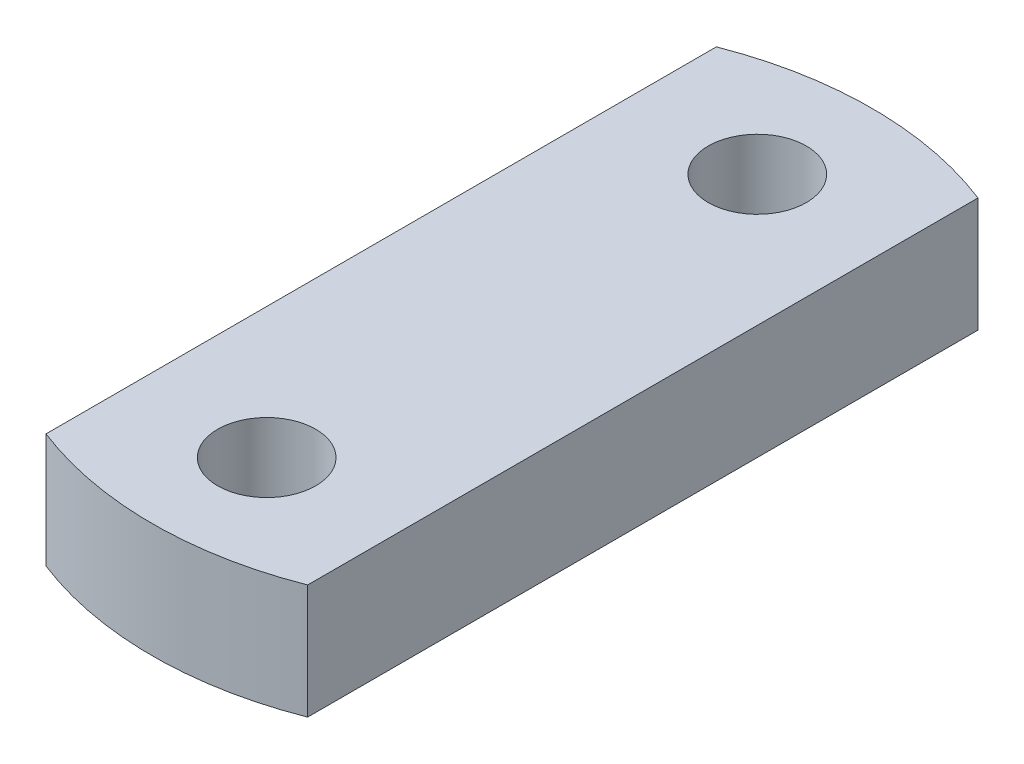
ISO-10303-21;
HEADER;
FILE_DESCRIPTION(('STEP AP214'),'2;1');
FILE_NAME('part.step','',(''),(''),'','','');
FILE_SCHEMA(('AUTOMOTIVE_DESIGN { 1 0 10303 214 1 1 1 1 }'));
ENDSEC;
DATA;
#1=APPLICATION_CONTEXT('core data for automotive mechanical design processes');
#2=APPLICATION_PROTOCOL_DEFINITION('international standard','automotive_design',2000,#1);
#3=PRODUCT_CONTEXT('',#1,'mechanical');
#4=PRODUCT('Part','Part','',(#3));
#5=PRODUCT_RELATED_PRODUCT_CATEGORY('part','',(#4));
#6=PRODUCT_DEFINITION_FORMATION('','',#4);
#7=PRODUCT_DEFINITION_CONTEXT('part definition',#1,'design');
#8=PRODUCT_DEFINITION('design','',#6,#7);
#9=PRODUCT_DEFINITION_SHAPE('','',#8);
#10=(LENGTH_UNIT() NAMED_UNIT(*) SI_UNIT(.MILLI.,.METRE.));
#11=(NAMED_UNIT(*) PLANE_ANGLE_UNIT() SI_UNIT($,.RADIAN.));
#12=(NAMED_UNIT(*) SI_UNIT($,.STERADIAN.) SOLID_ANGLE_UNIT());
#13=UNCERTAINTY_MEASURE_WITH_UNIT(LENGTH_MEASURE(1.E-05),#10,'distance_accuracy_value','');
#14=(GEOMETRIC_REPRESENTATION_CONTEXT(3) GLOBAL_UNCERTAINTY_ASSIGNED_CONTEXT((#13)) GLOBAL_UNIT_ASSIGNED_CONTEXT((#10,
#11,#12)) REPRESENTATION_CONTEXT('',''));
#15=CARTESIAN_POINT('',(0.,0.,0.));
#16=DIRECTION('',(0.,0.,1.));
#17=DIRECTION('',(1.,0.,0.));
#18=AXIS2_PLACEMENT_3D('',#15,#16,#17);
#19=CARTESIAN_POINT('',(0.,35.,0.));
#20=DIRECTION('',(0.,1.,0.));
#21=DIRECTION('',(0.,0.,1.));
#22=AXIS2_PLACEMENT_3D('',#19,#20,#21);
#23=PLANE('',#22);
#24=CARTESIAN_POINT('',(0.,35.,-75.));
#25=DIRECTION('',(0.,1.,0.));
#26=DIRECTION('',(0.,0.,1.));
#27=AXIS2_PLACEMENT_3D('',#24,#25,#26);
#28=CIRCLE('',#27,15.);
#29=CARTESIAN_POINT('',(0.,35.,-60.));
#30=VERTEX_POINT('',#29);
#31=EDGE_CURVE('E104',#30,#30,#28,.T.);
#32=ORIENTED_EDGE('',*,*,#31,.F.);
#33=EDGE_LOOP('',(#32));
#34=FACE_BOUND('',#33,.T.);
#35=CARTESIAN_POINT('',(0.,35.,0.));
#36=DIRECTION('',(0.,1.,0.));
#37=DIRECTION('',(0.,0.,1.));
#38=AXIS2_PLACEMENT_3D('',#35,#36,#37);
#39=CIRCLE('',#38,110.);
#40=CARTESIAN_POINT('',(40.,35.,-102.469507659596));
#41=VERTEX_POINT('',#40);
#42=CARTESIAN_POINT('',(-40.,35.,-102.469507659596));
#43=VERTEX_POINT('',#42);
#44=EDGE_CURVE('E89',#41,#43,#39,.T.);
#45=ORIENTED_EDGE('',*,*,#44,.T.);
#46=DIRECTION('',(0.,0.,1.));
#47=VECTOR('',#46,1.);
#48=CARTESIAN_POINT('',(-40.,35.,-102.469507659596));
#49=LINE('',#48,#47);
#50=CARTESIAN_POINT('',(-40.,35.,102.469507659596));
#51=VERTEX_POINT('',#50);
#52=EDGE_CURVE('E84',#43,#51,#49,.T.);
#53=ORIENTED_EDGE('',*,*,#52,.T.);
#54=CARTESIAN_POINT('',(0.,35.,0.));
#55=DIRECTION('',(0.,1.,0.));
#56=DIRECTION('',(0.,0.,1.));
#57=AXIS2_PLACEMENT_3D('',#54,#55,#56);
#58=CIRCLE('',#57,110.);
#59=CARTESIAN_POINT('',(40.,35.,102.469507659596));
#60=VERTEX_POINT('',#59);
#61=EDGE_CURVE('E87',#51,#60,#58,.T.);
#62=ORIENTED_EDGE('',*,*,#61,.T.);
#63=DIRECTION('',(0.,0.,-1.));
#64=VECTOR('',#63,1.);
#65=CARTESIAN_POINT('',(40.,35.,-102.469507659596));
#66=LINE('',#65,#64);
#67=EDGE_CURVE('E54',#60,#41,#66,.T.);
#68=ORIENTED_EDGE('',*,*,#67,.T.);
#69=EDGE_LOOP('',(#45,#53,#62,#68));
#70=FACE_BOUND('',#69,.T.);
#71=CARTESIAN_POINT('',(0.,35.,75.));
#72=DIRECTION('',(0.,1.,0.));
#73=DIRECTION('',(0.,0.,1.));
#74=AXIS2_PLACEMENT_3D('',#71,#72,#73);
#75=CIRCLE('',#74,15.);
#76=CARTESIAN_POINT('',(0.,35.,90.));
#77=VERTEX_POINT('',#76);
#78=EDGE_CURVE('E119',#77,#77,#75,.T.);
#79=ORIENTED_EDGE('',*,*,#78,.F.);
#80=EDGE_LOOP('',(#79));
#81=FACE_BOUND('',#80,.T.);
#82=ADVANCED_FACE('F37',(#34,#70,#81),#23,.T.);
#83=CARTESIAN_POINT('',(0.,0.,0.));
#84=DIRECTION('',(0.,1.,0.));
#85=DIRECTION('',(0.,0.,1.));
#86=AXIS2_PLACEMENT_3D('',#83,#84,#85);
#87=PLANE('',#86);
#88=CARTESIAN_POINT('',(0.,0.,0.));
#89=DIRECTION('',(0.,1.,0.));
#90=DIRECTION('',(0.,0.,1.));
#91=AXIS2_PLACEMENT_3D('',#88,#89,#90);
#92=CIRCLE('',#91,110.);
#93=CARTESIAN_POINT('',(40.,0.,-102.469507659596));
#94=VERTEX_POINT('',#93);
#95=CARTESIAN_POINT('',(-40.,0.,-102.469507659596));
#96=VERTEX_POINT('',#95);
#97=EDGE_CURVE('E101',#94,#96,#92,.T.);
#98=ORIENTED_EDGE('',*,*,#97,.F.);
#99=DIRECTION('',(0.,0.,-1.));
#100=VECTOR('',#99,1.);
#101=CARTESIAN_POINT('',(40.,0.,-102.469507659596));
#102=LINE('',#101,#100);
#103=CARTESIAN_POINT('',(40.,0.,102.469507659596));
#104=VERTEX_POINT('',#103);
#105=EDGE_CURVE('E77',#104,#94,#102,.T.);
#106=ORIENTED_EDGE('',*,*,#105,.F.);
#107=CARTESIAN_POINT('',(0.,0.,0.));
#108=DIRECTION('',(0.,1.,0.));
#109=DIRECTION('',(0.,0.,1.));
#110=AXIS2_PLACEMENT_3D('',#107,#108,#109);
#111=CIRCLE('',#110,110.);
#112=CARTESIAN_POINT('',(-40.,0.,102.469507659596));
#113=VERTEX_POINT('',#112);
#114=EDGE_CURVE('E71',#113,#104,#111,.T.);
#115=ORIENTED_EDGE('',*,*,#114,.F.);
#116=DIRECTION('',(0.,0.,1.));
#117=VECTOR('',#116,1.);
#118=CARTESIAN_POINT('',(-40.,0.,-102.469507659596));
#119=LINE('',#118,#117);
#120=EDGE_CURVE('E93',#96,#113,#119,.T.);
#121=ORIENTED_EDGE('',*,*,#120,.F.);
#122=EDGE_LOOP('',(#98,#106,#115,#121));
#123=FACE_BOUND('',#122,.T.);
#124=CARTESIAN_POINT('',(0.,0.,-75.));
#125=DIRECTION('',(0.,1.,0.));
#126=DIRECTION('',(0.,0.,1.));
#127=AXIS2_PLACEMENT_3D('',#124,#125,#126);
#128=CIRCLE('',#127,15.);
#129=CARTESIAN_POINT('',(0.,0.,-60.));
#130=VERTEX_POINT('',#129);
#131=EDGE_CURVE('E116',#130,#130,#128,.T.);
#132=ORIENTED_EDGE('',*,*,#131,.T.);
#133=EDGE_LOOP('',(#132));
#134=FACE_BOUND('',#133,.T.);
#135=CARTESIAN_POINT('',(0.,0.,75.));
#136=DIRECTION('',(0.,1.,0.));
#137=DIRECTION('',(0.,0.,1.));
#138=AXIS2_PLACEMENT_3D('',#135,#136,#137);
#139=CIRCLE('',#138,15.);
#140=CARTESIAN_POINT('',(0.,0.,90.));
#141=VERTEX_POINT('',#140);
#142=EDGE_CURVE('E122',#141,#141,#139,.T.);
#143=ORIENTED_EDGE('',*,*,#142,.T.);
#144=EDGE_LOOP('',(#143));
#145=FACE_BOUND('',#144,.T.);
#146=ADVANCED_FACE('F112',(#123,#134,#145),#87,.F.);
#147=CARTESIAN_POINT('',(0.,35.,0.));
#148=DIRECTION('',(0.,-1.,0.));
#149=DIRECTION('',(0.,0.,-1.));
#150=AXIS2_PLACEMENT_3D('',#147,#148,#149);
#151=CYLINDRICAL_SURFACE('',#150,110.);
#152=ORIENTED_EDGE('',*,*,#97,.T.);
#153=DIRECTION('',(0.,-1.,0.));
#154=VECTOR('',#153,1.);
#155=CARTESIAN_POINT('',(-40.,35.,-102.469507659596));
#156=LINE('',#155,#154);
#157=EDGE_CURVE('E11',#43,#96,#156,.T.);
#158=ORIENTED_EDGE('',*,*,#157,.F.);
#159=ORIENTED_EDGE('',*,*,#44,.F.);
#160=DIRECTION('',(0.,-1.,0.));
#161=VECTOR('',#160,1.);
#162=CARTESIAN_POINT('',(40.,35.,-102.469507659596));
#163=LINE('',#162,#161);
#164=EDGE_CURVE('E97',#41,#94,#163,.T.);
#165=ORIENTED_EDGE('',*,*,#164,.T.);
#166=EDGE_LOOP('',(#152,#158,#159,#165));
#167=FACE_BOUND('',#166,.T.);
#168=ADVANCED_FACE('F39',(#167),#151,.T.);
#169=CARTESIAN_POINT('',(-40.,35.,-102.469507659596));
#170=DIRECTION('',(1.,0.,0.));
#171=DIRECTION('',(0.,0.,-1.));
#172=AXIS2_PLACEMENT_3D('',#169,#170,#171);
#173=PLANE('',#172);
#174=ORIENTED_EDGE('',*,*,#120,.T.);
#175=DIRECTION('',(0.,-1.,0.));
#176=VECTOR('',#175,1.);
#177=CARTESIAN_POINT('',(-40.,35.,102.469507659596));
#178=LINE('',#177,#176);
#179=EDGE_CURVE('E46',#51,#113,#178,.T.);
#180=ORIENTED_EDGE('',*,*,#179,.F.);
#181=ORIENTED_EDGE('',*,*,#52,.F.);
#182=ORIENTED_EDGE('',*,*,#157,.T.);
#183=EDGE_LOOP('',(#174,#180,#181,#182));
#184=FACE_BOUND('',#183,.T.);
#185=ADVANCED_FACE('F92',(#184),#173,.F.);
#186=CARTESIAN_POINT('',(0.,35.,0.));
#187=DIRECTION('',(0.,-1.,0.));
#188=DIRECTION('',(0.,0.,-1.));
#189=AXIS2_PLACEMENT_3D('',#186,#187,#188);
#190=CYLINDRICAL_SURFACE('',#189,110.);
#191=ORIENTED_EDGE('',*,*,#114,.T.);
#192=DIRECTION('',(0.,-1.,0.));
#193=VECTOR('',#192,1.);
#194=CARTESIAN_POINT('',(40.,35.,102.469507659596));
#195=LINE('',#194,#193);
#196=EDGE_CURVE('E94',#60,#104,#195,.T.);
#197=ORIENTED_EDGE('',*,*,#196,.F.);
#198=ORIENTED_EDGE('',*,*,#61,.F.);
#199=ORIENTED_EDGE('',*,*,#179,.T.);
#200=EDGE_LOOP('',(#191,#197,#198,#199));
#201=FACE_BOUND('',#200,.T.);
#202=ADVANCED_FACE('F95',(#201),#190,.T.);
#203=CARTESIAN_POINT('',(40.,35.,-102.469507659596));
#204=DIRECTION('',(-1.,0.,0.));
#205=DIRECTION('',(0.,0.,1.));
#206=AXIS2_PLACEMENT_3D('',#203,#204,#205);
#207=PLANE('',#206);
#208=ORIENTED_EDGE('',*,*,#105,.T.);
#209=ORIENTED_EDGE('',*,*,#164,.F.);
#210=ORIENTED_EDGE('',*,*,#67,.F.);
#211=ORIENTED_EDGE('',*,*,#196,.T.);
#212=EDGE_LOOP('',(#208,#209,#210,#211));
#213=FACE_BOUND('',#212,.T.);
#214=ADVANCED_FACE('F109',(#213),#207,.F.);
#215=CARTESIAN_POINT('',(0.,35.,-75.));
#216=DIRECTION('',(0.,-1.,0.));
#217=DIRECTION('',(0.,0.,-1.));
#218=AXIS2_PLACEMENT_3D('',#215,#216,#217);
#219=CYLINDRICAL_SURFACE('',#218,15.);
#220=ORIENTED_EDGE('',*,*,#31,.T.);
#221=EDGE_LOOP('',(#220));
#222=FACE_BOUND('',#221,.T.);
#223=ORIENTED_EDGE('',*,*,#131,.F.);
#224=EDGE_LOOP('',(#223));
#225=FACE_BOUND('',#224,.T.);
#226=ADVANCED_FACE('F139',(#222,#225),#219,.F.);
#227=CARTESIAN_POINT('',(0.,35.,75.));
#228=DIRECTION('',(0.,-1.,0.));
#229=DIRECTION('',(0.,0.,-1.));
#230=AXIS2_PLACEMENT_3D('',#227,#228,#229);
#231=CYLINDRICAL_SURFACE('',#230,15.);
#232=ORIENTED_EDGE('',*,*,#78,.T.);
#233=EDGE_LOOP('',(#232));
#234=FACE_BOUND('',#233,.T.);
#235=ORIENTED_EDGE('',*,*,#142,.F.);
#236=EDGE_LOOP('',(#235));
#237=FACE_BOUND('',#236,.T.);
#238=ADVANCED_FACE('F128',(#234,#237),#231,.F.);
#239=CLOSED_SHELL('',(#82,#146,#168,#185,#202,#214,#226,#238));
#240=MANIFOLD_SOLID_BREP('B2',#239);
#241=ADVANCED_BREP_SHAPE_REPRESENTATION('',(#18,#240),#14);
#242=SHAPE_DEFINITION_REPRESENTATION(#9,#241);
ENDSEC;
END-ISO-10303-21;
